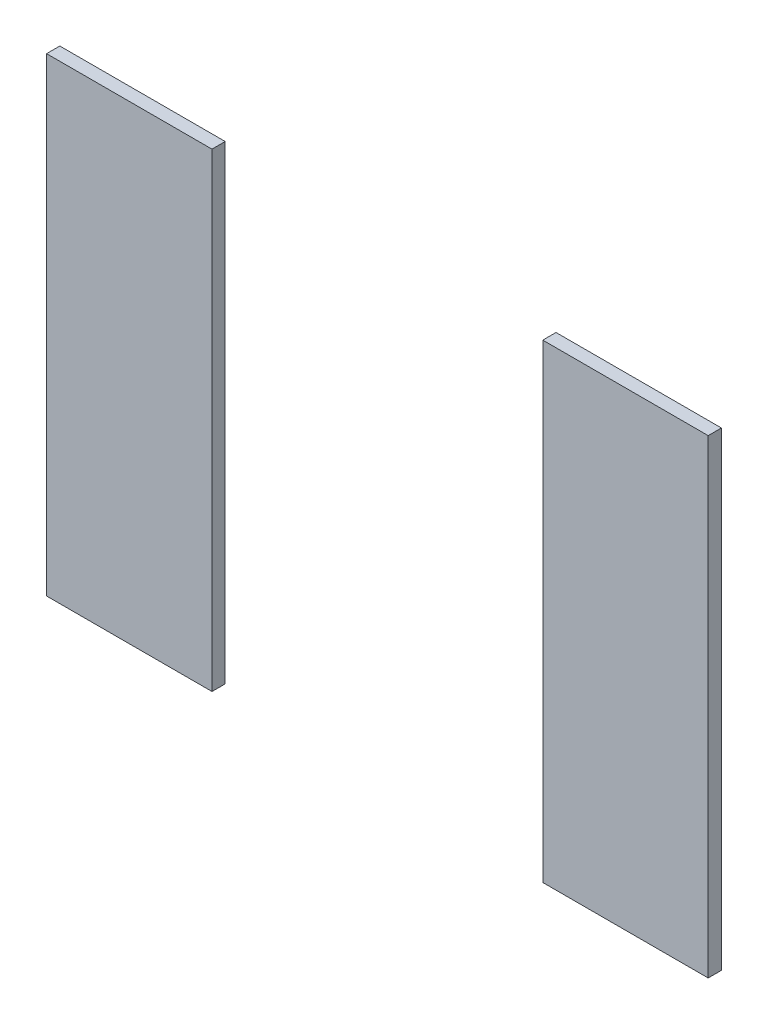
ISO-10303-21;
HEADER;
FILE_DESCRIPTION(('STEP AP214'),'2;1');
FILE_NAME('part.step','',(''),(''),'','','');
FILE_SCHEMA(('AUTOMOTIVE_DESIGN { 1 0 10303 214 1 1 1 1 }'));
ENDSEC;
DATA;
#1=APPLICATION_CONTEXT('core data for automotive mechanical design processes');
#2=APPLICATION_PROTOCOL_DEFINITION('international standard','automotive_design',2000,#1);
#3=PRODUCT_CONTEXT('',#1,'mechanical');
#4=PRODUCT('Part','Part','',(#3));
#5=PRODUCT_RELATED_PRODUCT_CATEGORY('part','',(#4));
#6=PRODUCT_DEFINITION_FORMATION('','',#4);
#7=PRODUCT_DEFINITION_CONTEXT('part definition',#1,'design');
#8=PRODUCT_DEFINITION('design','',#6,#7);
#9=PRODUCT_DEFINITION_SHAPE('','',#8);
#10=(LENGTH_UNIT() NAMED_UNIT(*) SI_UNIT(.MILLI.,.METRE.));
#11=(NAMED_UNIT(*) PLANE_ANGLE_UNIT() SI_UNIT($,.RADIAN.));
#12=(NAMED_UNIT(*) SI_UNIT($,.STERADIAN.) SOLID_ANGLE_UNIT());
#13=UNCERTAINTY_MEASURE_WITH_UNIT(LENGTH_MEASURE(1.E-05),#10,'distance_accuracy_value','');
#14=(GEOMETRIC_REPRESENTATION_CONTEXT(3) GLOBAL_UNCERTAINTY_ASSIGNED_CONTEXT((#13)) GLOBAL_UNIT_ASSIGNED_CONTEXT((#10,
#11,#12)) REPRESENTATION_CONTEXT('',''));
#15=CARTESIAN_POINT('',(0.,0.,0.));
#16=DIRECTION('',(0.,0.,1.));
#17=DIRECTION('',(1.,0.,0.));
#18=AXIS2_PLACEMENT_3D('',#15,#16,#17);
#19=CARTESIAN_POINT('',(250.,0.,10.));
#20=DIRECTION('',(-1.,0.,0.));
#21=DIRECTION('',(0.,-1.,0.));
#22=AXIS2_PLACEMENT_3D('',#19,#20,#21);
#23=PLANE('',#22);
#24=DIRECTION('',(0.,1.,0.));
#25=VECTOR('',#24,1.);
#26=CARTESIAN_POINT('',(250.,0.,-10.));
#27=LINE('',#26,#25);
#28=CARTESIAN_POINT('',(250.,-710.,-10.));
#29=VERTEX_POINT('',#28);
#30=CARTESIAN_POINT('',(250.,0.,-10.));
#31=VERTEX_POINT('',#30);
#32=EDGE_CURVE('E110',#29,#31,#27,.T.);
#33=ORIENTED_EDGE('',*,*,#32,.F.);
#34=DIRECTION('',(0.,0.,-1.));
#35=VECTOR('',#34,1.);
#36=CARTESIAN_POINT('',(250.,-710.,10.));
#37=LINE('',#36,#35);
#38=CARTESIAN_POINT('',(250.,-710.,10.));
#39=VERTEX_POINT('',#38);
#40=EDGE_CURVE('E12',#39,#29,#37,.T.);
#41=ORIENTED_EDGE('',*,*,#40,.F.);
#42=DIRECTION('',(0.,1.,0.));
#43=VECTOR('',#42,1.);
#44=CARTESIAN_POINT('',(250.,0.,10.));
#45=LINE('',#44,#43);
#46=CARTESIAN_POINT('',(250.,0.,10.));
#47=VERTEX_POINT('',#46);
#48=EDGE_CURVE('E95',#39,#47,#45,.T.);
#49=ORIENTED_EDGE('',*,*,#48,.T.);
#50=DIRECTION('',(0.,0.,-1.));
#51=VECTOR('',#50,1.);
#52=CARTESIAN_POINT('',(250.,0.,10.));
#53=LINE('',#52,#51);
#54=EDGE_CURVE('E63',#47,#31,#53,.T.);
#55=ORIENTED_EDGE('',*,*,#54,.T.);
#56=EDGE_LOOP('',(#33,#41,#49,#55));
#57=FACE_BOUND('',#56,.T.);
#58=ADVANCED_FACE('F47',(#57),#23,.T.);
#59=CARTESIAN_POINT('',(0.,-710.,10.));
#60=DIRECTION('',(0.,1.,0.));
#61=DIRECTION('',(0.,0.,1.));
#62=AXIS2_PLACEMENT_3D('',#59,#60,#61);
#63=PLANE('',#62);
#64=DIRECTION('',(1.,0.,0.));
#65=VECTOR('',#64,1.);
#66=CARTESIAN_POINT('',(0.,-710.,-10.));
#67=LINE('',#66,#65);
#68=CARTESIAN_POINT('',(500.,-710.,-10.));
#69=VERTEX_POINT('',#68);
#70=EDGE_CURVE('E101',#29,#69,#67,.T.);
#71=ORIENTED_EDGE('',*,*,#70,.T.);
#72=DIRECTION('',(0.,0.,-1.));
#73=VECTOR('',#72,1.);
#74=CARTESIAN_POINT('',(500.,-710.,10.));
#75=LINE('',#74,#73);
#76=CARTESIAN_POINT('',(500.,-710.,10.));
#77=VERTEX_POINT('',#76);
#78=EDGE_CURVE('E55',#77,#69,#75,.T.);
#79=ORIENTED_EDGE('',*,*,#78,.F.);
#80=DIRECTION('',(1.,0.,0.));
#81=VECTOR('',#80,1.);
#82=CARTESIAN_POINT('',(0.,-710.,10.));
#83=LINE('',#82,#81);
#84=EDGE_CURVE('E89',#39,#77,#83,.T.);
#85=ORIENTED_EDGE('',*,*,#84,.F.);
#86=ORIENTED_EDGE('',*,*,#40,.T.);
#87=EDGE_LOOP('',(#71,#79,#85,#86));
#88=FACE_BOUND('',#87,.T.);
#89=ADVANCED_FACE('F99',(#88),#63,.F.);
#90=CARTESIAN_POINT('',(500.,0.,10.));
#91=DIRECTION('',(1.,0.,0.));
#92=DIRECTION('',(0.,1.,0.));
#93=AXIS2_PLACEMENT_3D('',#90,#91,#92);
#94=PLANE('',#93);
#95=DIRECTION('',(0.,-1.,0.));
#96=VECTOR('',#95,1.);
#97=CARTESIAN_POINT('',(500.,0.,-10.));
#98=LINE('',#97,#96);
#99=CARTESIAN_POINT('',(500.,0.,-10.));
#100=VERTEX_POINT('',#99);
#101=EDGE_CURVE('E113',#100,#69,#98,.T.);
#102=ORIENTED_EDGE('',*,*,#101,.F.);
#103=DIRECTION('',(0.,0.,-1.));
#104=VECTOR('',#103,1.);
#105=CARTESIAN_POINT('',(500.,0.,10.));
#106=LINE('',#105,#104);
#107=CARTESIAN_POINT('',(500.,0.,10.));
#108=VERTEX_POINT('',#107);
#109=EDGE_CURVE('E76',#108,#100,#106,.T.);
#110=ORIENTED_EDGE('',*,*,#109,.F.);
#111=DIRECTION('',(0.,-1.,0.));
#112=VECTOR('',#111,1.);
#113=CARTESIAN_POINT('',(500.,0.,10.));
#114=LINE('',#113,#112);
#115=EDGE_CURVE('E94',#108,#77,#114,.T.);
#116=ORIENTED_EDGE('',*,*,#115,.T.);
#117=ORIENTED_EDGE('',*,*,#78,.T.);
#118=EDGE_LOOP('',(#102,#110,#116,#117));
#119=FACE_BOUND('',#118,.T.);
#120=ADVANCED_FACE('F104',(#119),#94,.T.);
#121=CARTESIAN_POINT('',(0.,0.,10.));
#122=DIRECTION('',(0.,1.,0.));
#123=DIRECTION('',(-1.,0.,0.));
#124=AXIS2_PLACEMENT_3D('',#121,#122,#123);
#125=PLANE('',#124);
#126=DIRECTION('',(1.,0.,0.));
#127=VECTOR('',#126,1.);
#128=CARTESIAN_POINT('',(0.,0.,-10.));
#129=LINE('',#128,#127);
#130=EDGE_CURVE('E115',#31,#100,#129,.T.);
#131=ORIENTED_EDGE('',*,*,#130,.F.);
#132=ORIENTED_EDGE('',*,*,#54,.F.);
#133=DIRECTION('',(1.,0.,0.));
#134=VECTOR('',#133,1.);
#135=CARTESIAN_POINT('',(0.,0.,10.));
#136=LINE('',#135,#134);
#137=EDGE_CURVE('E105',#47,#108,#136,.T.);
#138=ORIENTED_EDGE('',*,*,#137,.T.);
#139=ORIENTED_EDGE('',*,*,#109,.T.);
#140=EDGE_LOOP('',(#131,#132,#138,#139));
#141=FACE_BOUND('',#140,.T.);
#142=ADVANCED_FACE('F120',(#141),#125,.T.);
#143=CARTESIAN_POINT('',(0.,0.,10.));
#144=DIRECTION('',(0.,0.,1.));
#145=DIRECTION('',(1.,0.,0.));
#146=AXIS2_PLACEMENT_3D('',#143,#144,#145);
#147=PLANE('',#146);
#148=ORIENTED_EDGE('',*,*,#48,.F.);
#149=ORIENTED_EDGE('',*,*,#84,.T.);
#150=ORIENTED_EDGE('',*,*,#115,.F.);
#151=ORIENTED_EDGE('',*,*,#137,.F.);
#152=EDGE_LOOP('',(#148,#149,#150,#151));
#153=FACE_BOUND('',#152,.T.);
#154=ADVANCED_FACE('F91',(#153),#147,.T.);
#155=CARTESIAN_POINT('',(0.,0.,-10.));
#156=DIRECTION('',(0.,0.,1.));
#157=DIRECTION('',(1.,0.,0.));
#158=AXIS2_PLACEMENT_3D('',#155,#156,#157);
#159=PLANE('',#158);
#160=ORIENTED_EDGE('',*,*,#32,.T.);
#161=ORIENTED_EDGE('',*,*,#130,.T.);
#162=ORIENTED_EDGE('',*,*,#101,.T.);
#163=ORIENTED_EDGE('',*,*,#70,.F.);
#164=EDGE_LOOP('',(#160,#161,#162,#163));
#165=FACE_BOUND('',#164,.T.);
#166=ADVANCED_FACE('F127',(#165),#159,.F.);
#167=CLOSED_SHELL('',(#58,#89,#120,#142,#154,#166));
#168=MANIFOLD_SOLID_BREP('B2',#167);
#169=CARTESIAN_POINT('',(-500.,0.,10.));
#170=DIRECTION('',(1.,0.,0.));
#171=DIRECTION('',(0.,1.,0.));
#172=AXIS2_PLACEMENT_3D('',#169,#170,#171);
#173=PLANE('',#172);
#174=DIRECTION('',(0.,-1.,0.));
#175=VECTOR('',#174,1.);
#176=CARTESIAN_POINT('',(-500.,0.,-10.));
#177=LINE('',#176,#175);
#178=CARTESIAN_POINT('',(-500.,0.,-10.));
#179=VERTEX_POINT('',#178);
#180=CARTESIAN_POINT('',(-500.,-710.,-10.));
#181=VERTEX_POINT('',#180);
#182=EDGE_CURVE('E234',#179,#181,#177,.T.);
#183=ORIENTED_EDGE('',*,*,#182,.T.);
#184=DIRECTION('',(0.,0.,-1.));
#185=VECTOR('',#184,1.);
#186=CARTESIAN_POINT('',(-500.,-710.,10.));
#187=LINE('',#186,#185);
#188=CARTESIAN_POINT('',(-500.,-710.,10.));
#189=VERTEX_POINT('',#188);
#190=EDGE_CURVE('E45',#189,#181,#187,.T.);
#191=ORIENTED_EDGE('',*,*,#190,.F.);
#192=DIRECTION('',(0.,-1.,0.));
#193=VECTOR('',#192,1.);
#194=CARTESIAN_POINT('',(-500.,0.,10.));
#195=LINE('',#194,#193);
#196=CARTESIAN_POINT('',(-500.,0.,10.));
#197=VERTEX_POINT('',#196);
#198=EDGE_CURVE('E220',#197,#189,#195,.T.);
#199=ORIENTED_EDGE('',*,*,#198,.F.);
#200=DIRECTION('',(0.,0.,-1.));
#201=VECTOR('',#200,1.);
#202=CARTESIAN_POINT('',(-500.,0.,10.));
#203=LINE('',#202,#201);
#204=EDGE_CURVE('E187',#197,#179,#203,.T.);
#205=ORIENTED_EDGE('',*,*,#204,.T.);
#206=EDGE_LOOP('',(#183,#191,#199,#205));
#207=FACE_BOUND('',#206,.T.);
#208=ADVANCED_FACE('F171',(#207),#173,.F.);
#209=CARTESIAN_POINT('',(0.,-710.,10.));
#210=DIRECTION('',(0.,1.,0.));
#211=DIRECTION('',(0.,0.,1.));
#212=AXIS2_PLACEMENT_3D('',#209,#210,#211);
#213=PLANE('',#212);
#214=DIRECTION('',(1.,0.,0.));
#215=VECTOR('',#214,1.);
#216=CARTESIAN_POINT('',(0.,-710.,-10.));
#217=LINE('',#216,#215);
#218=CARTESIAN_POINT('',(-250.,-710.,-10.));
#219=VERTEX_POINT('',#218);
#220=EDGE_CURVE('E225',#181,#219,#217,.T.);
#221=ORIENTED_EDGE('',*,*,#220,.T.);
#222=DIRECTION('',(0.,0.,-1.));
#223=VECTOR('',#222,1.);
#224=CARTESIAN_POINT('',(-250.,-710.,10.));
#225=LINE('',#224,#223);
#226=CARTESIAN_POINT('',(-250.,-710.,10.));
#227=VERTEX_POINT('',#226);
#228=EDGE_CURVE('E179',#227,#219,#225,.T.);
#229=ORIENTED_EDGE('',*,*,#228,.F.);
#230=DIRECTION('',(1.,0.,0.));
#231=VECTOR('',#230,1.);
#232=CARTESIAN_POINT('',(0.,-710.,10.));
#233=LINE('',#232,#231);
#234=EDGE_CURVE('E212',#189,#227,#233,.T.);
#235=ORIENTED_EDGE('',*,*,#234,.F.);
#236=ORIENTED_EDGE('',*,*,#190,.T.);
#237=EDGE_LOOP('',(#221,#229,#235,#236));
#238=FACE_BOUND('',#237,.T.);
#239=ADVANCED_FACE('F224',(#238),#213,.F.);
#240=CARTESIAN_POINT('',(-250.,0.,10.));
#241=DIRECTION('',(1.,0.,0.));
#242=DIRECTION('',(0.,1.,0.));
#243=AXIS2_PLACEMENT_3D('',#240,#241,#242);
#244=PLANE('',#243);
#245=DIRECTION('',(0.,-1.,0.));
#246=VECTOR('',#245,1.);
#247=CARTESIAN_POINT('',(-250.,0.,-10.));
#248=LINE('',#247,#246);
#249=CARTESIAN_POINT('',(-250.,0.,-10.));
#250=VERTEX_POINT('',#249);
#251=EDGE_CURVE('E237',#250,#219,#248,.T.);
#252=ORIENTED_EDGE('',*,*,#251,.F.);
#253=DIRECTION('',(0.,0.,-1.));
#254=VECTOR('',#253,1.);
#255=CARTESIAN_POINT('',(-250.,0.,10.));
#256=LINE('',#255,#254);
#257=CARTESIAN_POINT('',(-250.,0.,10.));
#258=VERTEX_POINT('',#257);
#259=EDGE_CURVE('E201',#258,#250,#256,.T.);
#260=ORIENTED_EDGE('',*,*,#259,.F.);
#261=DIRECTION('',(0.,-1.,0.));
#262=VECTOR('',#261,1.);
#263=CARTESIAN_POINT('',(-250.,0.,10.));
#264=LINE('',#263,#262);
#265=EDGE_CURVE('E219',#258,#227,#264,.T.);
#266=ORIENTED_EDGE('',*,*,#265,.T.);
#267=ORIENTED_EDGE('',*,*,#228,.T.);
#268=EDGE_LOOP('',(#252,#260,#266,#267));
#269=FACE_BOUND('',#268,.T.);
#270=ADVANCED_FACE('F228',(#269),#244,.T.);
#271=CARTESIAN_POINT('',(0.,0.,10.));
#272=DIRECTION('',(0.,1.,0.));
#273=DIRECTION('',(-1.,0.,0.));
#274=AXIS2_PLACEMENT_3D('',#271,#272,#273);
#275=PLANE('',#274);
#276=DIRECTION('',(1.,0.,0.));
#277=VECTOR('',#276,1.);
#278=CARTESIAN_POINT('',(0.,0.,-10.));
#279=LINE('',#278,#277);
#280=EDGE_CURVE('E239',#179,#250,#279,.T.);
#281=ORIENTED_EDGE('',*,*,#280,.F.);
#282=ORIENTED_EDGE('',*,*,#204,.F.);
#283=DIRECTION('',(1.,0.,0.));
#284=VECTOR('',#283,1.);
#285=CARTESIAN_POINT('',(0.,0.,10.));
#286=LINE('',#285,#284);
#287=EDGE_CURVE('E229',#197,#258,#286,.T.);
#288=ORIENTED_EDGE('',*,*,#287,.T.);
#289=ORIENTED_EDGE('',*,*,#259,.T.);
#290=EDGE_LOOP('',(#281,#282,#288,#289));
#291=FACE_BOUND('',#290,.T.);
#292=ADVANCED_FACE('F245',(#291),#275,.T.);
#293=CARTESIAN_POINT('',(0.,0.,10.));
#294=DIRECTION('',(0.,0.,1.));
#295=DIRECTION('',(1.,0.,0.));
#296=AXIS2_PLACEMENT_3D('',#293,#294,#295);
#297=PLANE('',#296);
#298=ORIENTED_EDGE('',*,*,#198,.T.);
#299=ORIENTED_EDGE('',*,*,#234,.T.);
#300=ORIENTED_EDGE('',*,*,#265,.F.);
#301=ORIENTED_EDGE('',*,*,#287,.F.);
#302=EDGE_LOOP('',(#298,#299,#300,#301));
#303=FACE_BOUND('',#302,.T.);
#304=ADVANCED_FACE('F216',(#303),#297,.T.);
#305=CARTESIAN_POINT('',(0.,0.,-10.));
#306=DIRECTION('',(0.,0.,1.));
#307=DIRECTION('',(1.,0.,0.));
#308=AXIS2_PLACEMENT_3D('',#305,#306,#307);
#309=PLANE('',#308);
#310=ORIENTED_EDGE('',*,*,#182,.F.);
#311=ORIENTED_EDGE('',*,*,#280,.T.);
#312=ORIENTED_EDGE('',*,*,#251,.T.);
#313=ORIENTED_EDGE('',*,*,#220,.F.);
#314=EDGE_LOOP('',(#310,#311,#312,#313));
#315=FACE_BOUND('',#314,.T.);
#316=ADVANCED_FACE('F244',(#315),#309,.F.);
#317=CLOSED_SHELL('',(#208,#239,#270,#292,#304,#316));
#318=MANIFOLD_SOLID_BREP('B6',#317);
#319=ADVANCED_BREP_SHAPE_REPRESENTATION('',(#18,#168,#318),#14);
#320=SHAPE_DEFINITION_REPRESENTATION(#9,#319);
ENDSEC;
END-ISO-10303-21;
